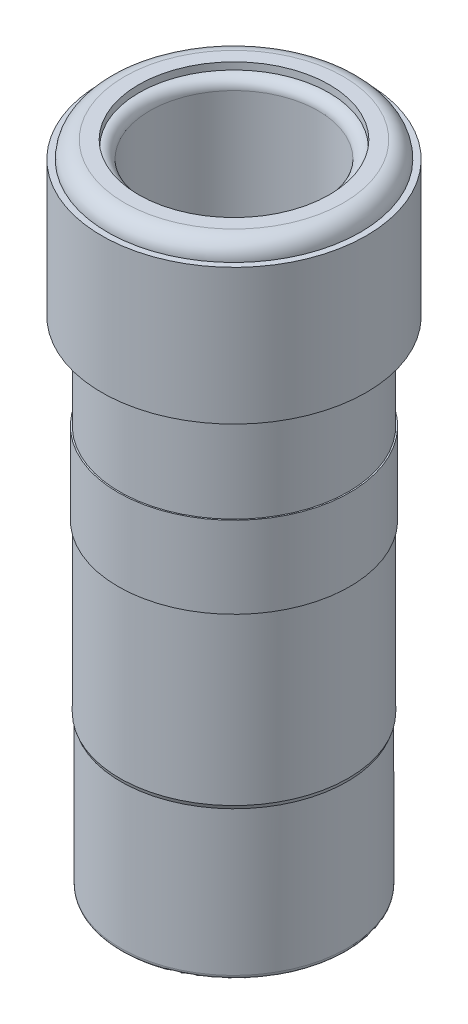
ISO-10303-21;
HEADER;
FILE_DESCRIPTION(('STEP AP214'),'2;1');
FILE_NAME('part.step','',(''),(''),'','','');
FILE_SCHEMA(('AUTOMOTIVE_DESIGN { 1 0 10303 214 1 1 1 1 }'));
ENDSEC;
DATA;
#1=APPLICATION_CONTEXT('core data for automotive mechanical design processes');
#2=APPLICATION_PROTOCOL_DEFINITION('international standard','automotive_design',2000,#1);
#3=PRODUCT_CONTEXT('',#1,'mechanical');
#4=PRODUCT('Part','Part','',(#3));
#5=PRODUCT_RELATED_PRODUCT_CATEGORY('part','',(#4));
#6=PRODUCT_DEFINITION_FORMATION('','',#4);
#7=PRODUCT_DEFINITION_CONTEXT('part definition',#1,'design');
#8=PRODUCT_DEFINITION('design','',#6,#7);
#9=PRODUCT_DEFINITION_SHAPE('','',#8);
#10=(LENGTH_UNIT() NAMED_UNIT(*) SI_UNIT(.MILLI.,.METRE.));
#11=(NAMED_UNIT(*) PLANE_ANGLE_UNIT() SI_UNIT($,.RADIAN.));
#12=(NAMED_UNIT(*) SI_UNIT($,.STERADIAN.) SOLID_ANGLE_UNIT());
#13=UNCERTAINTY_MEASURE_WITH_UNIT(LENGTH_MEASURE(1.E-05),#10,'distance_accuracy_value','');
#14=(GEOMETRIC_REPRESENTATION_CONTEXT(3) GLOBAL_UNCERTAINTY_ASSIGNED_CONTEXT((#13)) GLOBAL_UNIT_ASSIGNED_CONTEXT((#10,
#11,#12)) REPRESENTATION_CONTEXT('',''));
#15=CARTESIAN_POINT('',(0.,0.,0.));
#16=DIRECTION('',(0.,0.,1.));
#17=DIRECTION('',(1.,0.,0.));
#18=AXIS2_PLACEMENT_3D('',#15,#16,#17);
#19=CARTESIAN_POINT('',(0.,22.6,0.));
#20=DIRECTION('',(0.,1.,0.));
#21=DIRECTION('',(-1.,0.,0.));
#22=AXIS2_PLACEMENT_3D('',#19,#20,#21);
#23=CYLINDRICAL_SURFACE('',#22,2.48);
#24=CARTESIAN_POINT('',(0.,22.6,0.));
#25=DIRECTION('',(0.,1.,0.));
#26=DIRECTION('',(-1.,0.,0.));
#27=AXIS2_PLACEMENT_3D('',#24,#25,#26);
#28=CIRCLE('',#27,2.48);
#29=CARTESIAN_POINT('',(-2.48000000000001,22.6,0.));
#30=VERTEX_POINT('',#29);
#31=EDGE_CURVE('E91',#30,#30,#28,.T.);
#32=ORIENTED_EDGE('',*,*,#31,.T.);
#33=EDGE_LOOP('',(#32));
#34=FACE_BOUND('',#33,.T.);
#35=CARTESIAN_POINT('',(0.,9.5,0.));
#36=DIRECTION('',(0.,-1.,0.));
#37=DIRECTION('',(1.,0.,0.));
#38=AXIS2_PLACEMENT_3D('',#35,#36,#37);
#39=CIRCLE('',#38,2.48);
#40=CARTESIAN_POINT('',(2.48,9.5,0.));
#41=VERTEX_POINT('',#40);
#42=EDGE_CURVE('E119',#41,#41,#39,.T.);
#43=ORIENTED_EDGE('',*,*,#42,.T.);
#44=EDGE_LOOP('',(#43));
#45=FACE_BOUND('',#44,.T.);
#46=ADVANCED_FACE('F38',(#34,#45),#23,.F.);
#47=CARTESIAN_POINT('',(0.,0.,0.));
#48=DIRECTION('',(0.,-1.,0.));
#49=DIRECTION('',(0.,0.,-1.));
#50=AXIS2_PLACEMENT_3D('',#47,#48,#49);
#51=CYLINDRICAL_SURFACE('',#50,3.33);
#52=CARTESIAN_POINT('',(0.,4.13,0.));
#53=DIRECTION('',(0.,-1.,0.));
#54=DIRECTION('',(1.,0.,0.));
#55=AXIS2_PLACEMENT_3D('',#52,#53,#54);
#56=CIRCLE('',#55,3.33);
#57=CARTESIAN_POINT('',(3.33,4.13,0.));
#58=VERTEX_POINT('',#57);
#59=EDGE_CURVE('E53',#58,#58,#56,.F.);
#60=ORIENTED_EDGE('',*,*,#59,.T.);
#61=EDGE_LOOP('',(#60));
#62=FACE_BOUND('',#61,.T.);
#63=CARTESIAN_POINT('',(0.,8.38152251477549,0.));
#64=DIRECTION('',(0.,-1.,0.));
#65=DIRECTION('',(0.,0.,-1.));
#66=AXIS2_PLACEMENT_3D('',#63,#64,#65);
#67=CIRCLE('',#66,3.33);
#68=CARTESIAN_POINT('',(0.,8.38152251477549,-3.33));
#69=VERTEX_POINT('',#68);
#70=EDGE_CURVE('E111',#69,#69,#67,.T.);
#71=ORIENTED_EDGE('',*,*,#70,.T.);
#72=EDGE_LOOP('',(#71));
#73=FACE_BOUND('',#72,.T.);
#74=ADVANCED_FACE('F150',(#62,#73),#51,.T.);
#75=CARTESIAN_POINT('',(-3.37,15.8,0.));
#76=DIRECTION('',(0.,-1.,0.));
#77=DIRECTION('',(1.,0.,0.));
#78=AXIS2_PLACEMENT_3D('',#75,#76,#77);
#79=PLANE('',#78);
#80=CARTESIAN_POINT('',(0.,15.8,0.));
#81=DIRECTION('',(0.,-1.,0.));
#82=DIRECTION('',(1.,0.,0.));
#83=AXIS2_PLACEMENT_3D('',#80,#81,#82);
#84=CIRCLE('',#83,3.37);
#85=CARTESIAN_POINT('',(3.37,15.8,0.));
#86=VERTEX_POINT('',#85);
#87=EDGE_CURVE('E79',#86,#86,#84,.T.);
#88=ORIENTED_EDGE('',*,*,#87,.T.);
#89=EDGE_LOOP('',(#88));
#90=FACE_BOUND('',#89,.T.);
#91=CARTESIAN_POINT('',(0.,15.8,0.));
#92=DIRECTION('',(0.,-1.,0.));
#93=DIRECTION('',(0.,0.,-1.));
#94=AXIS2_PLACEMENT_3D('',#91,#92,#93);
#95=CIRCLE('',#94,3.41);
#96=CARTESIAN_POINT('',(0.,15.8,-3.41));
#97=VERTEX_POINT('',#96);
#98=EDGE_CURVE('E99',#97,#97,#95,.T.);
#99=ORIENTED_EDGE('',*,*,#98,.F.);
#100=EDGE_LOOP('',(#99));
#101=FACE_BOUND('',#100,.T.);
#102=ADVANCED_FACE('F157',(#90,#101),#79,.F.);
#103=CARTESIAN_POINT('',(-3.225,23.1,0.));
#104=DIRECTION('',(0.,-1.,0.));
#105=DIRECTION('',(1.,0.,0.));
#106=AXIS2_PLACEMENT_3D('',#103,#104,#105);
#107=PLANE('',#106);
#108=CARTESIAN_POINT('',(0.,23.1,0.));
#109=DIRECTION('',(0.,1.,0.));
#110=DIRECTION('',(-1.,0.,0.));
#111=AXIS2_PLACEMENT_3D('',#108,#109,#110);
#112=CIRCLE('',#111,2.81051653328323);
#113=CARTESIAN_POINT('',(-2.81051653328323,23.1,0.));
#114=VERTEX_POINT('',#113);
#115=EDGE_CURVE('E87',#114,#114,#112,.T.);
#116=ORIENTED_EDGE('',*,*,#115,.F.);
#117=EDGE_LOOP('',(#116));
#118=FACE_BOUND('',#117,.T.);
#119=CARTESIAN_POINT('',(0.,23.1,0.));
#120=DIRECTION('',(0.,-1.,0.));
#121=DIRECTION('',(1.,0.,0.));
#122=AXIS2_PLACEMENT_3D('',#119,#120,#121);
#123=CIRCLE('',#122,3.22499999999999);
#124=CARTESIAN_POINT('',(3.22499999999999,23.1,0.));
#125=VERTEX_POINT('',#124);
#126=EDGE_CURVE('E59',#125,#125,#123,.T.);
#127=ORIENTED_EDGE('',*,*,#126,.F.);
#128=EDGE_LOOP('',(#127));
#129=FACE_BOUND('',#128,.T.);
#130=ADVANCED_FACE('F211',(#118,#129),#107,.F.);
#131=CARTESIAN_POINT('',(0.,22.6,0.));
#132=DIRECTION('',(0.,-1.,0.));
#133=DIRECTION('',(1.,0.,0.));
#134=AXIS2_PLACEMENT_3D('',#131,#132,#133);
#135=TOROIDAL_SURFACE('',#134,3.22499999999999,0.5);
#136=CARTESIAN_POINT('',(0.,22.6,0.));
#137=DIRECTION('',(0.,-1.,0.));
#138=DIRECTION('',(1.,0.,0.));
#139=AXIS2_PLACEMENT_3D('',#136,#137,#138);
#140=CIRCLE('',#139,3.72499999999999);
#141=CARTESIAN_POINT('',(3.72499999999999,22.6,0.));
#142=VERTEX_POINT('',#141);
#143=EDGE_CURVE('E63',#142,#142,#140,.T.);
#144=ORIENTED_EDGE('',*,*,#143,.F.);
#145=EDGE_LOOP('',(#144));
#146=FACE_BOUND('',#145,.T.);
#147=ORIENTED_EDGE('',*,*,#126,.T.);
#148=EDGE_LOOP('',(#147));
#149=FACE_BOUND('',#148,.T.);
#150=ADVANCED_FACE('F217',(#146,#149),#135,.T.);
#151=CARTESIAN_POINT('',(-3.9,22.6,0.));
#152=DIRECTION('',(0.,-1.,0.));
#153=DIRECTION('',(1.,0.,0.));
#154=AXIS2_PLACEMENT_3D('',#151,#152,#153);
#155=PLANE('',#154);
#156=CARTESIAN_POINT('',(0.,22.6,0.));
#157=DIRECTION('',(0.,-1.,0.));
#158=DIRECTION('',(1.,0.,0.));
#159=AXIS2_PLACEMENT_3D('',#156,#157,#158);
#160=CIRCLE('',#159,3.9);
#161=CARTESIAN_POINT('',(3.89999999999999,22.6,0.));
#162=VERTEX_POINT('',#161);
#163=EDGE_CURVE('E67',#162,#162,#160,.T.);
#164=ORIENTED_EDGE('',*,*,#163,.F.);
#165=EDGE_LOOP('',(#164));
#166=FACE_BOUND('',#165,.T.);
#167=ORIENTED_EDGE('',*,*,#143,.T.);
#168=EDGE_LOOP('',(#167));
#169=FACE_BOUND('',#168,.T.);
#170=ADVANCED_FACE('F230',(#166,#169),#155,.F.);
#171=CARTESIAN_POINT('',(0.,0.,0.));
#172=DIRECTION('',(0.,-1.,0.));
#173=DIRECTION('',(1.,0.,0.));
#174=AXIS2_PLACEMENT_3D('',#171,#172,#173);
#175=CYLINDRICAL_SURFACE('',#174,3.9);
#176=CARTESIAN_POINT('',(0.,18.6,0.));
#177=DIRECTION('',(0.,-1.,0.));
#178=DIRECTION('',(1.,0.,0.));
#179=AXIS2_PLACEMENT_3D('',#176,#177,#178);
#180=CIRCLE('',#179,3.9);
#181=CARTESIAN_POINT('',(3.89999999999999,18.6,0.));
#182=VERTEX_POINT('',#181);
#183=EDGE_CURVE('E71',#182,#182,#180,.T.);
#184=ORIENTED_EDGE('',*,*,#183,.F.);
#185=EDGE_LOOP('',(#184));
#186=FACE_BOUND('',#185,.T.);
#187=ORIENTED_EDGE('',*,*,#163,.T.);
#188=EDGE_LOOP('',(#187));
#189=FACE_BOUND('',#188,.T.);
#190=ADVANCED_FACE('F226',(#186,#189),#175,.T.);
#191=CARTESIAN_POINT('',(-3.9,18.6,0.));
#192=DIRECTION('',(0.,1.,0.));
#193=DIRECTION('',(-1.,0.,0.));
#194=AXIS2_PLACEMENT_3D('',#191,#192,#193);
#195=PLANE('',#194);
#196=CARTESIAN_POINT('',(0.,18.6,0.));
#197=DIRECTION('',(0.,-1.,0.));
#198=DIRECTION('',(1.,0.,0.));
#199=AXIS2_PLACEMENT_3D('',#196,#197,#198);
#200=CIRCLE('',#199,3.37);
#201=CARTESIAN_POINT('',(3.37,18.6,0.));
#202=VERTEX_POINT('',#201);
#203=EDGE_CURVE('E75',#202,#202,#200,.T.);
#204=ORIENTED_EDGE('',*,*,#203,.F.);
#205=EDGE_LOOP('',(#204));
#206=FACE_BOUND('',#205,.T.);
#207=ORIENTED_EDGE('',*,*,#183,.T.);
#208=EDGE_LOOP('',(#207));
#209=FACE_BOUND('',#208,.T.);
#210=ADVANCED_FACE('F222',(#206,#209),#195,.F.);
#211=CARTESIAN_POINT('',(0.,0.,0.));
#212=DIRECTION('',(0.,-1.,0.));
#213=DIRECTION('',(1.,0.,0.));
#214=AXIS2_PLACEMENT_3D('',#211,#212,#213);
#215=CYLINDRICAL_SURFACE('',#214,3.37);
#216=ORIENTED_EDGE('',*,*,#87,.F.);
#217=EDGE_LOOP('',(#216));
#218=FACE_BOUND('',#217,.T.);
#219=ORIENTED_EDGE('',*,*,#203,.T.);
#220=EDGE_LOOP('',(#219));
#221=FACE_BOUND('',#220,.T.);
#222=ADVANCED_FACE('F173',(#218,#221),#215,.T.);
#223=CARTESIAN_POINT('',(0.,22.8993325909419,0.));
#224=DIRECTION('',(0.,1.,0.));
#225=DIRECTION('',(-1.,0.,0.));
#226=AXIS2_PLACEMENT_3D('',#223,#224,#225);
#227=CONICAL_SURFACE('',#226,2.80000000000001,0.0523598775598313);
#228=ORIENTED_EDGE('',*,*,#115,.T.);
#229=EDGE_LOOP('',(#228));
#230=FACE_BOUND('',#229,.T.);
#231=CARTESIAN_POINT('',(0.,22.8993325909419,0.));
#232=DIRECTION('',(0.,1.,0.));
#233=DIRECTION('',(-1.,0.,0.));
#234=AXIS2_PLACEMENT_3D('',#231,#232,#233);
#235=CIRCLE('',#234,2.80000000000001);
#236=CARTESIAN_POINT('',(-2.80000000000002,22.8993325909419,0.));
#237=VERTEX_POINT('',#236);
#238=EDGE_CURVE('E95',#237,#237,#235,.T.);
#239=ORIENTED_EDGE('',*,*,#238,.F.);
#240=EDGE_LOOP('',(#239));
#241=FACE_BOUND('',#240,.T.);
#242=ADVANCED_FACE('F165',(#230,#241),#227,.F.);
#243=CARTESIAN_POINT('',(0.,8.,0.));
#244=DIRECTION('',(0.,-1.,0.));
#245=DIRECTION('',(1.,0.,0.));
#246=AXIS2_PLACEMENT_3D('',#243,#244,#245);
#247=CIRCLE('',#246,2.48);
#248=CARTESIAN_POINT('',(2.48,8.,0.));
#249=VERTEX_POINT('',#248);
#250=EDGE_CURVE('E10',#249,#249,#247,.T.);
#251=ORIENTED_EDGE('',*,*,#250,.F.);
#252=EDGE_LOOP('',(#251));
#253=FACE_BOUND('',#252,.T.);
#254=CARTESIAN_POINT('',(0.,4.,0.));
#255=DIRECTION('',(0.,-1.,0.));
#256=DIRECTION('',(1.,0.,0.));
#257=AXIS2_PLACEMENT_3D('',#254,#255,#256);
#258=CIRCLE('',#257,2.48);
#259=CARTESIAN_POINT('',(2.48,4.,0.));
#260=VERTEX_POINT('',#259);
#261=EDGE_CURVE('E115',#260,#260,#258,.T.);
#262=ORIENTED_EDGE('',*,*,#261,.T.);
#263=EDGE_LOOP('',(#262));
#264=FACE_BOUND('',#263,.T.);
#265=ADVANCED_FACE('F153',(#253,#264),#23,.F.);
#266=CARTESIAN_POINT('',(0.,22.6,0.));
#267=DIRECTION('',(0.,1.,0.));
#268=DIRECTION('',(-1.,0.,0.));
#269=AXIS2_PLACEMENT_3D('',#266,#267,#268);
#270=TOROIDAL_SURFACE('',#269,2.78,0.300000000000001);
#271=ORIENTED_EDGE('',*,*,#238,.T.);
#272=EDGE_LOOP('',(#271));
#273=FACE_BOUND('',#272,.T.);
#274=ORIENTED_EDGE('',*,*,#31,.F.);
#275=EDGE_LOOP('',(#274));
#276=FACE_BOUND('',#275,.T.);
#277=ADVANCED_FACE('F164',(#273,#276),#270,.T.);
#278=CARTESIAN_POINT('',(0.,0.,0.));
#279=DIRECTION('',(0.,-1.,0.));
#280=DIRECTION('',(0.,0.,-1.));
#281=AXIS2_PLACEMENT_3D('',#278,#279,#280);
#282=CYLINDRICAL_SURFACE('',#281,3.41);
#283=ORIENTED_EDGE('',*,*,#98,.T.);
#284=EDGE_LOOP('',(#283));
#285=FACE_BOUND('',#284,.T.);
#286=CARTESIAN_POINT('',(0.,13.4,0.));
#287=DIRECTION('',(0.,-1.,0.));
#288=DIRECTION('',(0.,0.,-1.));
#289=AXIS2_PLACEMENT_3D('',#286,#287,#288);
#290=CIRCLE('',#289,3.41);
#291=CARTESIAN_POINT('',(0.,13.4,-3.41));
#292=VERTEX_POINT('',#291);
#293=EDGE_CURVE('E103',#292,#292,#290,.T.);
#294=ORIENTED_EDGE('',*,*,#293,.F.);
#295=EDGE_LOOP('',(#294));
#296=FACE_BOUND('',#295,.T.);
#297=ADVANCED_FACE('F171',(#285,#296),#282,.T.);
#298=CARTESIAN_POINT('',(0.,0.,0.));
#299=DIRECTION('',(0.,-1.,0.));
#300=DIRECTION('',(1.,0.,0.));
#301=AXIS2_PLACEMENT_3D('',#298,#299,#300);
#302=CYLINDRICAL_SURFACE('',#301,3.37);
#303=CARTESIAN_POINT('',(0.,13.4,0.));
#304=DIRECTION('',(0.,-1.,0.));
#305=DIRECTION('',(1.,0.,0.));
#306=AXIS2_PLACEMENT_3D('',#303,#304,#305);
#307=CIRCLE('',#306,3.37);
#308=CARTESIAN_POINT('',(3.37,13.4,0.));
#309=VERTEX_POINT('',#308);
#310=EDGE_CURVE('E83',#309,#309,#307,.T.);
#311=ORIENTED_EDGE('',*,*,#310,.T.);
#312=EDGE_LOOP('',(#311));
#313=FACE_BOUND('',#312,.T.);
#314=CARTESIAN_POINT('',(0.,8.49142161155367,0.));
#315=DIRECTION('',(0.,-1.,0.));
#316=DIRECTION('',(0.,0.,-1.));
#317=AXIS2_PLACEMENT_3D('',#314,#315,#316);
#318=CIRCLE('',#317,3.37);
#319=CARTESIAN_POINT('',(0.,8.49142161155367,-3.37));
#320=VERTEX_POINT('',#319);
#321=EDGE_CURVE('E107',#320,#320,#318,.T.);
#322=ORIENTED_EDGE('',*,*,#321,.F.);
#323=EDGE_LOOP('',(#322));
#324=FACE_BOUND('',#323,.T.);
#325=ADVANCED_FACE('F194',(#313,#324),#302,.T.);
#326=CARTESIAN_POINT('',(-3.37,13.4,0.));
#327=DIRECTION('',(0.,1.,0.));
#328=DIRECTION('',(-1.,0.,0.));
#329=AXIS2_PLACEMENT_3D('',#326,#327,#328);
#330=PLANE('',#329);
#331=ORIENTED_EDGE('',*,*,#310,.F.);
#332=EDGE_LOOP('',(#331));
#333=FACE_BOUND('',#332,.T.);
#334=ORIENTED_EDGE('',*,*,#293,.T.);
#335=EDGE_LOOP('',(#334));
#336=FACE_BOUND('',#335,.T.);
#337=ADVANCED_FACE('F188',(#333,#336),#330,.F.);
#338=CARTESIAN_POINT('',(0.,8.38152251477549,0.));
#339=DIRECTION('',(0.,1.,0.));
#340=DIRECTION('',(0.,0.,1.));
#341=AXIS2_PLACEMENT_3D('',#338,#339,#340);
#342=CONICAL_SURFACE('',#341,3.33,0.349065850398859);
#343=ORIENTED_EDGE('',*,*,#321,.T.);
#344=EDGE_LOOP('',(#343));
#345=FACE_BOUND('',#344,.T.);
#346=ORIENTED_EDGE('',*,*,#70,.F.);
#347=EDGE_LOOP('',(#346));
#348=FACE_BOUND('',#347,.T.);
#349=ADVANCED_FACE('F180',(#345,#348),#342,.T.);
#350=CARTESIAN_POINT('',(0.,4.,0.));
#351=DIRECTION('',(0.,-1.,0.));
#352=DIRECTION('',(1.,0.,0.));
#353=AXIS2_PLACEMENT_3D('',#350,#351,#352);
#354=PLANE('',#353);
#355=ORIENTED_EDGE('',*,*,#261,.F.);
#356=EDGE_LOOP('',(#355));
#357=FACE_BOUND('',#356,.T.);
#358=CARTESIAN_POINT('',(0.,4.,0.));
#359=DIRECTION('',(0.,-1.,0.));
#360=DIRECTION('',(1.,0.,0.));
#361=AXIS2_PLACEMENT_3D('',#358,#359,#360);
#362=CIRCLE('',#361,3.2);
#363=CARTESIAN_POINT('',(3.2,4.,0.));
#364=VERTEX_POINT('',#363);
#365=EDGE_CURVE('E47',#364,#364,#362,.T.);
#366=ORIENTED_EDGE('',*,*,#365,.T.);
#367=EDGE_LOOP('',(#366));
#368=FACE_BOUND('',#367,.T.);
#369=ADVANCED_FACE('F146',(#357,#368),#354,.T.);
#370=CARTESIAN_POINT('',(0.,4.13,0.));
#371=DIRECTION('',(0.,-1.,0.));
#372=DIRECTION('',(1.,0.,0.));
#373=AXIS2_PLACEMENT_3D('',#370,#371,#372);
#374=TOROIDAL_SURFACE('',#373,3.2,0.13);
#375=ORIENTED_EDGE('',*,*,#365,.F.);
#376=EDGE_LOOP('',(#375));
#377=FACE_BOUND('',#376,.T.);
#378=ORIENTED_EDGE('',*,*,#59,.F.);
#379=EDGE_LOOP('',(#378));
#380=FACE_BOUND('',#379,.T.);
#381=ADVANCED_FACE('F40',(#377,#380),#374,.T.);
#382=CARTESIAN_POINT('',(0.,8.,0.));
#383=DIRECTION('',(0.,-1.,0.));
#384=DIRECTION('',(1.,0.,0.));
#385=AXIS2_PLACEMENT_3D('',#382,#383,#384);
#386=PLANE('',#385);
#387=CARTESIAN_POINT('',(0.,8.,0.));
#388=DIRECTION('',(0.,-1.,0.));
#389=DIRECTION('',(1.,0.,0.));
#390=AXIS2_PLACEMENT_3D('',#387,#388,#389);
#391=CIRCLE('',#390,1.79922635564094);
#392=CARTESIAN_POINT('',(1.79922635564094,8.,0.));
#393=VERTEX_POINT('',#392);
#394=EDGE_CURVE('E42',#393,#393,#391,.T.);
#395=ORIENTED_EDGE('',*,*,#394,.F.);
#396=EDGE_LOOP('',(#395));
#397=FACE_BOUND('',#396,.T.);
#398=ORIENTED_EDGE('',*,*,#250,.T.);
#399=EDGE_LOOP('',(#398));
#400=FACE_BOUND('',#399,.T.);
#401=ADVANCED_FACE('F136',(#397,#400),#386,.T.);
#402=CARTESIAN_POINT('',(0.,9.5,0.));
#403=DIRECTION('',(0.,-1.,0.));
#404=DIRECTION('',(1.,0.,0.));
#405=AXIS2_PLACEMENT_3D('',#402,#403,#404);
#406=PLANE('',#405);
#407=CARTESIAN_POINT('',(0.,9.5,0.));
#408=DIRECTION('',(0.,1.,0.));
#409=DIRECTION('',(-1.,0.,0.));
#410=AXIS2_PLACEMENT_3D('',#407,#408,#409);
#411=CIRCLE('',#410,1.79922635564094);
#412=CARTESIAN_POINT('',(-1.79922635564094,9.5,0.));
#413=VERTEX_POINT('',#412);
#414=EDGE_CURVE('E123',#413,#413,#411,.T.);
#415=ORIENTED_EDGE('',*,*,#414,.F.);
#416=EDGE_LOOP('',(#415));
#417=FACE_BOUND('',#416,.T.);
#418=ORIENTED_EDGE('',*,*,#42,.F.);
#419=EDGE_LOOP('',(#418));
#420=FACE_BOUND('',#419,.T.);
#421=ADVANCED_FACE('F138',(#417,#420),#406,.F.);
#422=CARTESIAN_POINT('',(0.,-0.5,0.));
#423=DIRECTION('',(0.,1.,0.));
#424=DIRECTION('',(-1.,0.,0.));
#425=AXIS2_PLACEMENT_3D('',#422,#423,#424);
#426=CYLINDRICAL_SURFACE('',#425,1.79922635564094);
#427=ORIENTED_EDGE('',*,*,#394,.T.);
#428=EDGE_LOOP('',(#427));
#429=FACE_BOUND('',#428,.T.);
#430=ORIENTED_EDGE('',*,*,#414,.T.);
#431=EDGE_LOOP('',(#430));
#432=FACE_BOUND('',#431,.T.);
#433=ADVANCED_FACE('F134',(#429,#432),#426,.F.);
#434=CLOSED_SHELL('',(#46,#74,#102,#130,#150,#170,#190,#210,#222,#242,#265,#277,#297,#325,#337,
#349,#369,#381,#401,#421,#433));
#435=MANIFOLD_SOLID_BREP('B2',#434);
#436=ADVANCED_BREP_SHAPE_REPRESENTATION('',(#18,#435),#14);
#437=SHAPE_DEFINITION_REPRESENTATION(#9,#436);
ENDSEC;
END-ISO-10303-21;
